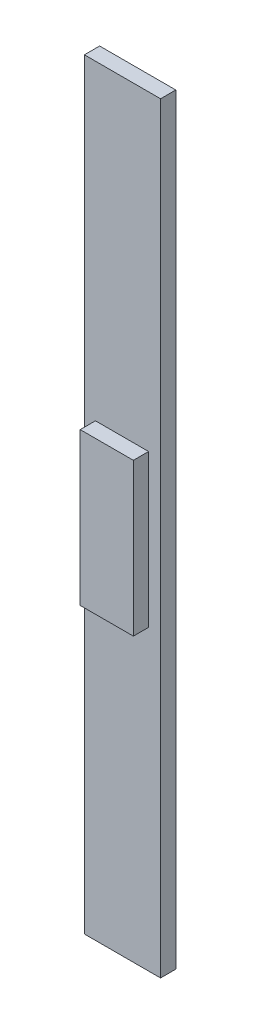
ISO-10303-21;
HEADER;
FILE_DESCRIPTION(('STEP AP214'),'2;1');
FILE_NAME('part.step','',(''),(''),'','','');
FILE_SCHEMA(('AUTOMOTIVE_DESIGN { 1 0 10303 214 1 1 1 1 }'));
ENDSEC;
DATA;
#1=APPLICATION_CONTEXT('core data for automotive mechanical design processes');
#2=APPLICATION_PROTOCOL_DEFINITION('international standard','automotive_design',2000,#1);
#3=PRODUCT_CONTEXT('',#1,'mechanical');
#4=PRODUCT('Part','Part','',(#3));
#5=PRODUCT_RELATED_PRODUCT_CATEGORY('part','',(#4));
#6=PRODUCT_DEFINITION_FORMATION('','',#4);
#7=PRODUCT_DEFINITION_CONTEXT('part definition',#1,'design');
#8=PRODUCT_DEFINITION('design','',#6,#7);
#9=PRODUCT_DEFINITION_SHAPE('','',#8);
#10=(LENGTH_UNIT() NAMED_UNIT(*) SI_UNIT(.MILLI.,.METRE.));
#11=(NAMED_UNIT(*) PLANE_ANGLE_UNIT() SI_UNIT($,.RADIAN.));
#12=(NAMED_UNIT(*) SI_UNIT($,.STERADIAN.) SOLID_ANGLE_UNIT());
#13=UNCERTAINTY_MEASURE_WITH_UNIT(LENGTH_MEASURE(1.E-05),#10,'distance_accuracy_value','');
#14=(GEOMETRIC_REPRESENTATION_CONTEXT(3) GLOBAL_UNCERTAINTY_ASSIGNED_CONTEXT((#13)) GLOBAL_UNIT_ASSIGNED_CONTEXT((#10,
#11,#12)) REPRESENTATION_CONTEXT('',''));
#15=CARTESIAN_POINT('',(0.,0.,0.));
#16=DIRECTION('',(0.,0.,1.));
#17=DIRECTION('',(1.,0.,0.));
#18=AXIS2_PLACEMENT_3D('',#15,#16,#17);
#19=CARTESIAN_POINT('',(0.,0.,254.));
#20=DIRECTION('',(0.,0.,-1.));
#21=DIRECTION('',(-1.,0.,0.));
#22=AXIS2_PLACEMENT_3D('',#19,#20,#21);
#23=PLANE('',#22);
#24=DIRECTION('',(0.,-1.,0.));
#25=VECTOR('',#24,1.);
#26=CARTESIAN_POINT('',(0.,0.,254.));
#27=LINE('',#26,#25);
#28=CARTESIAN_POINT('',(0.,12700.,254.));
#29=VERTEX_POINT('',#28);
#30=CARTESIAN_POINT('',(0.,0.,254.));
#31=VERTEX_POINT('',#30);
#32=EDGE_CURVE('E130',#29,#31,#27,.T.);
#33=ORIENTED_EDGE('',*,*,#32,.T.);
#34=DIRECTION('',(1.,0.,0.));
#35=VECTOR('',#34,1.);
#36=CARTESIAN_POINT('',(0.,0.,254.));
#37=LINE('',#36,#35);
#38=CARTESIAN_POINT('',(1270.,0.,254.));
#39=VERTEX_POINT('',#38);
#40=EDGE_CURVE('E133',#31,#39,#37,.T.);
#41=ORIENTED_EDGE('',*,*,#40,.T.);
#42=DIRECTION('',(0.,1.,0.));
#43=VECTOR('',#42,1.);
#44=CARTESIAN_POINT('',(1270.,0.,254.));
#45=LINE('',#44,#43);
#46=CARTESIAN_POINT('',(1270.,12700.,254.));
#47=VERTEX_POINT('',#46);
#48=EDGE_CURVE('E136',#39,#47,#45,.T.);
#49=ORIENTED_EDGE('',*,*,#48,.T.);
#50=DIRECTION('',(-1.,0.,0.));
#51=VECTOR('',#50,1.);
#52=CARTESIAN_POINT('',(0.,12700.,254.));
#53=LINE('',#52,#51);
#54=EDGE_CURVE('E138',#47,#29,#53,.T.);
#55=ORIENTED_EDGE('',*,*,#54,.T.);
#56=EDGE_LOOP('',(#33,#41,#49,#55));
#57=FACE_BOUND('',#56,.T.);
#58=DIRECTION('',(0.,-1.,0.));
#59=VECTOR('',#58,1.);
#60=CARTESIAN_POINT('',(184.123558311698,7505.09593342826,254.));
#61=LINE('',#60,#59);
#62=CARTESIAN_POINT('',(184.123558311698,7505.09593342826,254.));
#63=VERTEX_POINT('',#62);
#64=CARTESIAN_POINT('',(184.123558311699,4965.09593342826,254.));
#65=VERTEX_POINT('',#64);
#66=EDGE_CURVE('E120',#63,#65,#61,.T.);
#67=ORIENTED_EDGE('',*,*,#66,.F.);
#68=DIRECTION('',(-1.,0.,0.));
#69=VECTOR('',#68,1.);
#70=CARTESIAN_POINT('',(184.123558311698,7505.09593342826,254.));
#71=LINE('',#70,#69);
#72=CARTESIAN_POINT('',(1070.37324359801,7505.09593342826,254.));
#73=VERTEX_POINT('',#72);
#74=EDGE_CURVE('E117',#73,#63,#71,.T.);
#75=ORIENTED_EDGE('',*,*,#74,.F.);
#76=DIRECTION('',(0.,1.,0.));
#77=VECTOR('',#76,1.);
#78=CARTESIAN_POINT('',(1070.37324359801,7505.09593342826,254.));
#79=LINE('',#78,#77);
#80=CARTESIAN_POINT('',(1070.37324359801,4965.09593342826,254.));
#81=VERTEX_POINT('',#80);
#82=EDGE_CURVE('E55',#81,#73,#79,.T.);
#83=ORIENTED_EDGE('',*,*,#82,.F.);
#84=DIRECTION('',(1.,0.,0.));
#85=VECTOR('',#84,1.);
#86=CARTESIAN_POINT('',(184.123558311699,4965.09593342826,254.));
#87=LINE('',#86,#85);
#88=EDGE_CURVE('E50',#65,#81,#87,.T.);
#89=ORIENTED_EDGE('',*,*,#88,.F.);
#90=EDGE_LOOP('',(#67,#75,#83,#89));
#91=FACE_BOUND('',#90,.T.);
#92=ADVANCED_FACE('F35',(#57,#91),#23,.F.);
#93=CARTESIAN_POINT('',(0.,0.,254.));
#94=DIRECTION('',(1.,0.,0.));
#95=DIRECTION('',(0.,0.,-1.));
#96=AXIS2_PLACEMENT_3D('',#93,#94,#95);
#97=PLANE('',#96);
#98=DIRECTION('',(0.,-1.,0.));
#99=VECTOR('',#98,1.);
#100=CARTESIAN_POINT('',(0.,0.,0.));
#101=LINE('',#100,#99);
#102=CARTESIAN_POINT('',(0.,12700.,0.));
#103=VERTEX_POINT('',#102);
#104=CARTESIAN_POINT('',(0.,0.,0.));
#105=VERTEX_POINT('',#104);
#106=EDGE_CURVE('E121',#103,#105,#101,.T.);
#107=ORIENTED_EDGE('',*,*,#106,.T.);
#108=DIRECTION('',(0.,0.,-1.));
#109=VECTOR('',#108,1.);
#110=CARTESIAN_POINT('',(0.,0.,254.));
#111=LINE('',#110,#109);
#112=EDGE_CURVE('E11',#31,#105,#111,.T.);
#113=ORIENTED_EDGE('',*,*,#112,.F.);
#114=ORIENTED_EDGE('',*,*,#32,.F.);
#115=DIRECTION('',(0.,0.,-1.));
#116=VECTOR('',#115,1.);
#117=CARTESIAN_POINT('',(0.,12700.,254.));
#118=LINE('',#117,#116);
#119=EDGE_CURVE('E139',#29,#103,#118,.T.);
#120=ORIENTED_EDGE('',*,*,#119,.T.);
#121=EDGE_LOOP('',(#107,#113,#114,#120));
#122=FACE_BOUND('',#121,.T.);
#123=ADVANCED_FACE('F37',(#122),#97,.F.);
#124=CARTESIAN_POINT('',(0.,0.,254.));
#125=DIRECTION('',(0.,1.,0.));
#126=DIRECTION('',(0.,0.,1.));
#127=AXIS2_PLACEMENT_3D('',#124,#125,#126);
#128=PLANE('',#127);
#129=DIRECTION('',(1.,0.,0.));
#130=VECTOR('',#129,1.);
#131=CARTESIAN_POINT('',(0.,0.,0.));
#132=LINE('',#131,#130);
#133=CARTESIAN_POINT('',(1270.,0.,0.));
#134=VERTEX_POINT('',#133);
#135=EDGE_CURVE('E124',#105,#134,#132,.T.);
#136=ORIENTED_EDGE('',*,*,#135,.T.);
#137=DIRECTION('',(0.,0.,-1.));
#138=VECTOR('',#137,1.);
#139=CARTESIAN_POINT('',(1270.,0.,254.));
#140=LINE('',#139,#138);
#141=EDGE_CURVE('E43',#39,#134,#140,.T.);
#142=ORIENTED_EDGE('',*,*,#141,.F.);
#143=ORIENTED_EDGE('',*,*,#40,.F.);
#144=ORIENTED_EDGE('',*,*,#112,.T.);
#145=EDGE_LOOP('',(#136,#142,#143,#144));
#146=FACE_BOUND('',#145,.T.);
#147=ADVANCED_FACE('F169',(#146),#128,.F.);
#148=CARTESIAN_POINT('',(1270.,0.,254.));
#149=DIRECTION('',(-1.,0.,0.));
#150=DIRECTION('',(0.,0.,1.));
#151=AXIS2_PLACEMENT_3D('',#148,#149,#150);
#152=PLANE('',#151);
#153=DIRECTION('',(0.,1.,0.));
#154=VECTOR('',#153,1.);
#155=CARTESIAN_POINT('',(1270.,0.,0.));
#156=LINE('',#155,#154);
#157=CARTESIAN_POINT('',(1270.,12700.,0.));
#158=VERTEX_POINT('',#157);
#159=EDGE_CURVE('E142',#134,#158,#156,.T.);
#160=ORIENTED_EDGE('',*,*,#159,.T.);
#161=DIRECTION('',(0.,0.,-1.));
#162=VECTOR('',#161,1.);
#163=CARTESIAN_POINT('',(1270.,12700.,254.));
#164=LINE('',#163,#162);
#165=EDGE_CURVE('E147',#47,#158,#164,.T.);
#166=ORIENTED_EDGE('',*,*,#165,.F.);
#167=ORIENTED_EDGE('',*,*,#48,.F.);
#168=ORIENTED_EDGE('',*,*,#141,.T.);
#169=EDGE_LOOP('',(#160,#166,#167,#168));
#170=FACE_BOUND('',#169,.T.);
#171=ADVANCED_FACE('F154',(#170),#152,.F.);
#172=CARTESIAN_POINT('',(0.,12700.,254.));
#173=DIRECTION('',(0.,-1.,0.));
#174=DIRECTION('',(0.,0.,-1.));
#175=AXIS2_PLACEMENT_3D('',#172,#173,#174);
#176=PLANE('',#175);
#177=DIRECTION('',(-1.,0.,0.));
#178=VECTOR('',#177,1.);
#179=CARTESIAN_POINT('',(0.,12700.,0.));
#180=LINE('',#179,#178);
#181=EDGE_CURVE('E134',#158,#103,#180,.T.);
#182=ORIENTED_EDGE('',*,*,#181,.T.);
#183=ORIENTED_EDGE('',*,*,#119,.F.);
#184=ORIENTED_EDGE('',*,*,#54,.F.);
#185=ORIENTED_EDGE('',*,*,#165,.T.);
#186=EDGE_LOOP('',(#182,#183,#184,#185));
#187=FACE_BOUND('',#186,.T.);
#188=ADVANCED_FACE('F163',(#187),#176,.F.);
#189=CARTESIAN_POINT('',(0.,0.,0.));
#190=DIRECTION('',(0.,0.,-1.));
#191=DIRECTION('',(-1.,0.,0.));
#192=AXIS2_PLACEMENT_3D('',#189,#190,#191);
#193=PLANE('',#192);
#194=ORIENTED_EDGE('',*,*,#106,.F.);
#195=ORIENTED_EDGE('',*,*,#181,.F.);
#196=ORIENTED_EDGE('',*,*,#159,.F.);
#197=ORIENTED_EDGE('',*,*,#135,.F.);
#198=EDGE_LOOP('',(#194,#195,#196,#197));
#199=FACE_BOUND('',#198,.T.);
#200=ADVANCED_FACE('F160',(#199),#193,.T.);
#201=CARTESIAN_POINT('',(184.123558311698,7505.09593342826,508.));
#202=DIRECTION('',(1.,0.,0.));
#203=DIRECTION('',(0.,1.,0.));
#204=AXIS2_PLACEMENT_3D('',#201,#202,#203);
#205=PLANE('',#204);
#206=ORIENTED_EDGE('',*,*,#66,.T.);
#207=DIRECTION('',(0.,0.,-1.));
#208=VECTOR('',#207,1.);
#209=CARTESIAN_POINT('',(184.123558311699,4965.09593342826,508.));
#210=LINE('',#209,#208);
#211=CARTESIAN_POINT('',(184.123558311699,4965.09593342826,508.));
#212=VERTEX_POINT('',#211);
#213=EDGE_CURVE('E101',#212,#65,#210,.T.);
#214=ORIENTED_EDGE('',*,*,#213,.F.);
#215=DIRECTION('',(0.,-1.,0.));
#216=VECTOR('',#215,1.);
#217=CARTESIAN_POINT('',(184.123558311698,7505.09593342826,508.));
#218=LINE('',#217,#216);
#219=CARTESIAN_POINT('',(184.123558311698,7505.09593342826,508.));
#220=VERTEX_POINT('',#219);
#221=EDGE_CURVE('E108',#220,#212,#218,.T.);
#222=ORIENTED_EDGE('',*,*,#221,.F.);
#223=DIRECTION('',(0.,0.,-1.));
#224=VECTOR('',#223,1.);
#225=CARTESIAN_POINT('',(184.123558311698,7505.09593342826,508.));
#226=LINE('',#225,#224);
#227=EDGE_CURVE('E262',#220,#63,#226,.T.);
#228=ORIENTED_EDGE('',*,*,#227,.T.);
#229=EDGE_LOOP('',(#206,#214,#222,#228));
#230=FACE_BOUND('',#229,.T.);
#231=ADVANCED_FACE('F119',(#230),#205,.F.);
#232=CARTESIAN_POINT('',(184.123558311699,4965.09593342826,508.));
#233=DIRECTION('',(0.,1.,0.));
#234=DIRECTION('',(0.,0.,1.));
#235=AXIS2_PLACEMENT_3D('',#232,#233,#234);
#236=PLANE('',#235);
#237=ORIENTED_EDGE('',*,*,#88,.T.);
#238=DIRECTION('',(0.,0.,-1.));
#239=VECTOR('',#238,1.);
#240=CARTESIAN_POINT('',(1070.37324359801,4965.09593342826,508.));
#241=LINE('',#240,#239);
#242=CARTESIAN_POINT('',(1070.37324359801,4965.09593342826,508.));
#243=VERTEX_POINT('',#242);
#244=EDGE_CURVE('E104',#243,#81,#241,.T.);
#245=ORIENTED_EDGE('',*,*,#244,.F.);
#246=DIRECTION('',(1.,0.,0.));
#247=VECTOR('',#246,1.);
#248=CARTESIAN_POINT('',(184.123558311699,4965.09593342826,508.));
#249=LINE('',#248,#247);
#250=EDGE_CURVE('E97',#212,#243,#249,.T.);
#251=ORIENTED_EDGE('',*,*,#250,.F.);
#252=ORIENTED_EDGE('',*,*,#213,.T.);
#253=EDGE_LOOP('',(#237,#245,#251,#252));
#254=FACE_BOUND('',#253,.T.);
#255=ADVANCED_FACE('F99',(#254),#236,.F.);
#256=CARTESIAN_POINT('',(1070.37324359801,7505.09593342826,508.));
#257=DIRECTION('',(-1.,0.,0.));
#258=DIRECTION('',(0.,-1.,0.));
#259=AXIS2_PLACEMENT_3D('',#256,#257,#258);
#260=PLANE('',#259);
#261=ORIENTED_EDGE('',*,*,#82,.T.);
#262=DIRECTION('',(0.,0.,-1.));
#263=VECTOR('',#262,1.);
#264=CARTESIAN_POINT('',(1070.37324359801,7505.09593342826,508.));
#265=LINE('',#264,#263);
#266=CARTESIAN_POINT('',(1070.37324359801,7505.09593342826,508.));
#267=VERTEX_POINT('',#266);
#268=EDGE_CURVE('E126',#267,#73,#265,.T.);
#269=ORIENTED_EDGE('',*,*,#268,.F.);
#270=DIRECTION('',(0.,1.,0.));
#271=VECTOR('',#270,1.);
#272=CARTESIAN_POINT('',(1070.37324359801,7505.09593342826,508.));
#273=LINE('',#272,#271);
#274=EDGE_CURVE('E107',#243,#267,#273,.T.);
#275=ORIENTED_EDGE('',*,*,#274,.F.);
#276=ORIENTED_EDGE('',*,*,#244,.T.);
#277=EDGE_LOOP('',(#261,#269,#275,#276));
#278=FACE_BOUND('',#277,.T.);
#279=ADVANCED_FACE('F205',(#278),#260,.F.);
#280=CARTESIAN_POINT('',(184.123558311698,7505.09593342826,508.));
#281=DIRECTION('',(0.,-1.,0.));
#282=DIRECTION('',(0.,0.,-1.));
#283=AXIS2_PLACEMENT_3D('',#280,#281,#282);
#284=PLANE('',#283);
#285=ORIENTED_EDGE('',*,*,#74,.T.);
#286=ORIENTED_EDGE('',*,*,#227,.F.);
#287=DIRECTION('',(-1.,0.,0.));
#288=VECTOR('',#287,1.);
#289=CARTESIAN_POINT('',(184.123558311698,7505.09593342826,508.));
#290=LINE('',#289,#288);
#291=EDGE_CURVE('E113',#267,#220,#290,.T.);
#292=ORIENTED_EDGE('',*,*,#291,.F.);
#293=ORIENTED_EDGE('',*,*,#268,.T.);
#294=EDGE_LOOP('',(#285,#286,#292,#293));
#295=FACE_BOUND('',#294,.T.);
#296=ADVANCED_FACE('F211',(#295),#284,.F.);
#297=CARTESIAN_POINT('',(0.,0.,508.));
#298=DIRECTION('',(0.,0.,1.));
#299=DIRECTION('',(1.,0.,0.));
#300=AXIS2_PLACEMENT_3D('',#297,#298,#299);
#301=PLANE('',#300);
#302=ORIENTED_EDGE('',*,*,#221,.T.);
#303=ORIENTED_EDGE('',*,*,#250,.T.);
#304=ORIENTED_EDGE('',*,*,#274,.T.);
#305=ORIENTED_EDGE('',*,*,#291,.T.);
#306=EDGE_LOOP('',(#302,#303,#304,#305));
#307=FACE_BOUND('',#306,.T.);
#308=ADVANCED_FACE('F111',(#307),#301,.T.);
#309=CLOSED_SHELL('',(#92,#123,#147,#171,#188,#200,#231,#255,#279,#296,#308));
#310=MANIFOLD_SOLID_BREP('B2',#309);
#311=ADVANCED_BREP_SHAPE_REPRESENTATION('',(#18,#310),#14);
#312=SHAPE_DEFINITION_REPRESENTATION(#9,#311);
ENDSEC;
END-ISO-10303-21;
